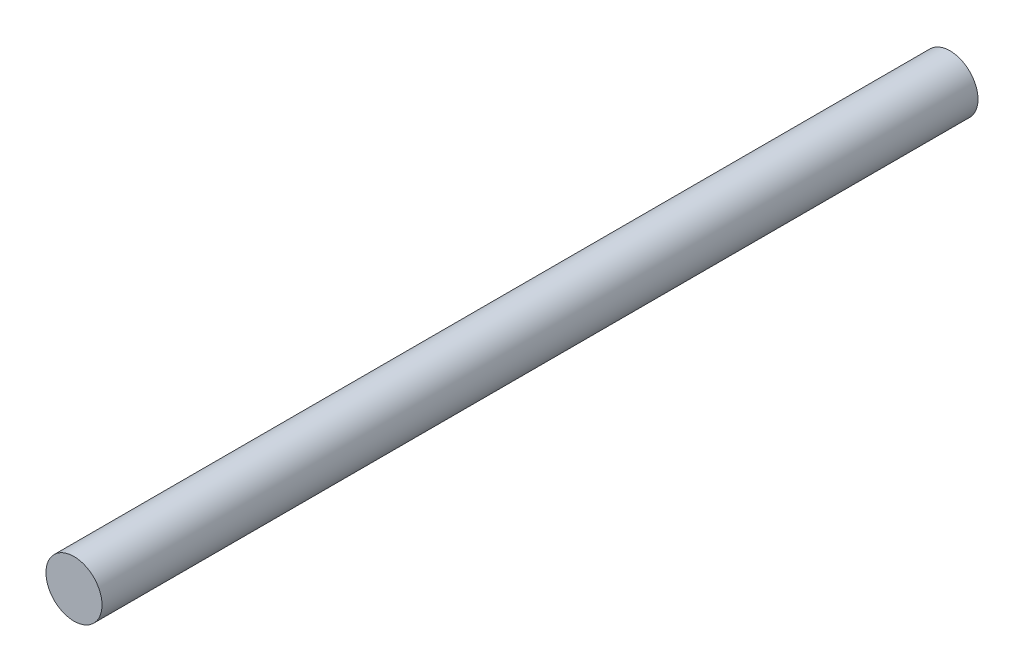
ISO-10303-21;
HEADER;
FILE_DESCRIPTION(('STEP AP214'),'2;1');
FILE_NAME('part.step','',(''),(''),'','','');
FILE_SCHEMA(('AUTOMOTIVE_DESIGN { 1 0 10303 214 1 1 1 1 }'));
ENDSEC;
DATA;
#1=APPLICATION_CONTEXT('core data for automotive mechanical design processes');
#2=APPLICATION_PROTOCOL_DEFINITION('international standard','automotive_design',2000,#1);
#3=PRODUCT_CONTEXT('',#1,'mechanical');
#4=PRODUCT('Part','Part','',(#3));
#5=PRODUCT_RELATED_PRODUCT_CATEGORY('part','',(#4));
#6=PRODUCT_DEFINITION_FORMATION('','',#4);
#7=PRODUCT_DEFINITION_CONTEXT('part definition',#1,'design');
#8=PRODUCT_DEFINITION('design','',#6,#7);
#9=PRODUCT_DEFINITION_SHAPE('','',#8);
#10=(LENGTH_UNIT() NAMED_UNIT(*) SI_UNIT(.MILLI.,.METRE.));
#11=(NAMED_UNIT(*) PLANE_ANGLE_UNIT() SI_UNIT($,.RADIAN.));
#12=(NAMED_UNIT(*) SI_UNIT($,.STERADIAN.) SOLID_ANGLE_UNIT());
#13=UNCERTAINTY_MEASURE_WITH_UNIT(LENGTH_MEASURE(1.E-05),#10,'distance_accuracy_value','');
#14=(GEOMETRIC_REPRESENTATION_CONTEXT(3) GLOBAL_UNCERTAINTY_ASSIGNED_CONTEXT((#13)) GLOBAL_UNIT_ASSIGNED_CONTEXT((#10,
#11,#12)) REPRESENTATION_CONTEXT('',''));
#15=CARTESIAN_POINT('',(0.,0.,0.));
#16=DIRECTION('',(0.,0.,1.));
#17=DIRECTION('',(1.,0.,0.));
#18=AXIS2_PLACEMENT_3D('',#15,#16,#17);
#19=CARTESIAN_POINT('',(0.,0.,50.));
#20=DIRECTION('',(0.,0.,-1.));
#21=DIRECTION('',(-1.,0.,0.));
#22=AXIS2_PLACEMENT_3D('',#19,#20,#21);
#23=CYLINDRICAL_SURFACE('',#22,1.6);
#24=CARTESIAN_POINT('',(0.,0.,50.));
#25=DIRECTION('',(0.,0.,1.));
#26=DIRECTION('',(1.,0.,0.));
#27=AXIS2_PLACEMENT_3D('',#24,#25,#26);
#28=CIRCLE('',#27,1.6);
#29=CARTESIAN_POINT('',(1.6,0.,50.));
#30=VERTEX_POINT('',#29);
#31=EDGE_CURVE('E12',#30,#30,#28,.T.);
#32=ORIENTED_EDGE('',*,*,#31,.F.);
#33=EDGE_LOOP('',(#32));
#34=FACE_BOUND('',#33,.T.);
#35=CARTESIAN_POINT('',(0.,0.,0.));
#36=DIRECTION('',(0.,0.,1.));
#37=DIRECTION('',(1.,0.,0.));
#38=AXIS2_PLACEMENT_3D('',#35,#36,#37);
#39=CIRCLE('',#38,1.6);
#40=CARTESIAN_POINT('',(1.6,0.,0.));
#41=VERTEX_POINT('',#40);
#42=EDGE_CURVE('E46',#41,#41,#39,.T.);
#43=ORIENTED_EDGE('',*,*,#42,.T.);
#44=EDGE_LOOP('',(#43));
#45=FACE_BOUND('',#44,.T.);
#46=ADVANCED_FACE('F43',(#34,#45),#23,.T.);
#47=CARTESIAN_POINT('',(0.,0.,50.));
#48=DIRECTION('',(0.,0.,1.));
#49=DIRECTION('',(1.,0.,0.));
#50=AXIS2_PLACEMENT_3D('',#47,#48,#49);
#51=PLANE('',#50);
#52=ORIENTED_EDGE('',*,*,#31,.T.);
#53=EDGE_LOOP('',(#52));
#54=FACE_BOUND('',#53,.T.);
#55=ADVANCED_FACE('F58',(#54),#51,.T.);
#56=CARTESIAN_POINT('',(0.,0.,0.));
#57=DIRECTION('',(0.,0.,1.));
#58=DIRECTION('',(1.,0.,0.));
#59=AXIS2_PLACEMENT_3D('',#56,#57,#58);
#60=PLANE('',#59);
#61=ORIENTED_EDGE('',*,*,#42,.F.);
#62=EDGE_LOOP('',(#61));
#63=FACE_BOUND('',#62,.T.);
#64=ADVANCED_FACE('F56',(#63),#60,.F.);
#65=CLOSED_SHELL('',(#46,#55,#64));
#66=MANIFOLD_SOLID_BREP('B2',#65);
#67=ADVANCED_BREP_SHAPE_REPRESENTATION('',(#18,#66),#14);
#68=SHAPE_DEFINITION_REPRESENTATION(#9,#67);
ENDSEC;
END-ISO-10303-21;
